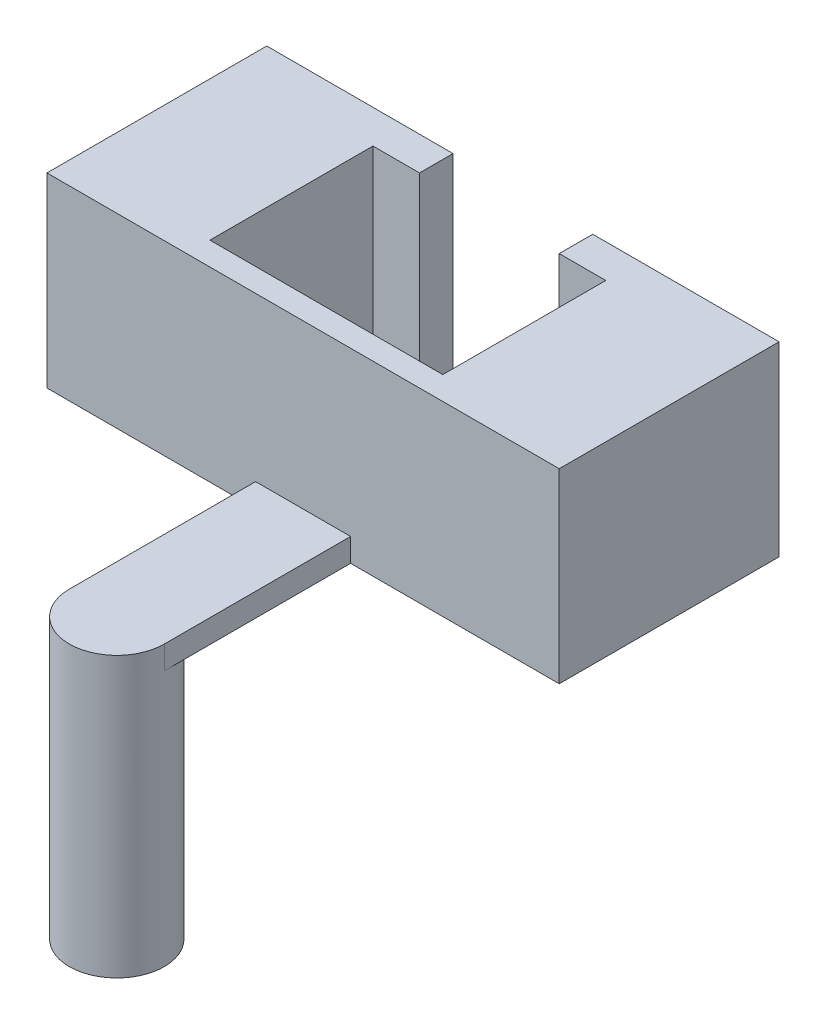
ISO-10303-21;
HEADER;
FILE_DESCRIPTION(('STEP AP214'),'2;1');
FILE_NAME('part.step','',(''),(''),'','','');
FILE_SCHEMA(('AUTOMOTIVE_DESIGN { 1 0 10303 214 1 1 1 1 }'));
ENDSEC;
DATA;
#1=APPLICATION_CONTEXT('core data for automotive mechanical design processes');
#2=APPLICATION_PROTOCOL_DEFINITION('international standard','automotive_design',2000,#1);
#3=PRODUCT_CONTEXT('',#1,'mechanical');
#4=PRODUCT('Part','Part','',(#3));
#5=PRODUCT_RELATED_PRODUCT_CATEGORY('part','',(#4));
#6=PRODUCT_DEFINITION_FORMATION('','',#4);
#7=PRODUCT_DEFINITION_CONTEXT('part definition',#1,'design');
#8=PRODUCT_DEFINITION('design','',#6,#7);
#9=PRODUCT_DEFINITION_SHAPE('','',#8);
#10=(LENGTH_UNIT() NAMED_UNIT(*) SI_UNIT(.MILLI.,.METRE.));
#11=(NAMED_UNIT(*) PLANE_ANGLE_UNIT() SI_UNIT($,.RADIAN.));
#12=(NAMED_UNIT(*) SI_UNIT($,.STERADIAN.) SOLID_ANGLE_UNIT());
#13=UNCERTAINTY_MEASURE_WITH_UNIT(LENGTH_MEASURE(1.E-05),#10,'distance_accuracy_value','');
#14=(GEOMETRIC_REPRESENTATION_CONTEXT(3) GLOBAL_UNCERTAINTY_ASSIGNED_CONTEXT((#13)) GLOBAL_UNIT_ASSIGNED_CONTEXT((#10,
#11,#12)) REPRESENTATION_CONTEXT('',''));
#15=CARTESIAN_POINT('',(0.,0.,0.));
#16=DIRECTION('',(0.,0.,1.));
#17=DIRECTION('',(1.,0.,0.));
#18=AXIS2_PLACEMENT_3D('',#15,#16,#17);
#19=CARTESIAN_POINT('',(-1.73411216451389,76.2,-7.70716517561729));
#20=DIRECTION('',(0.,-1.,0.));
#21=DIRECTION('',(0.,0.,-1.));
#22=AXIS2_PLACEMENT_3D('',#19,#20,#21);
#23=CYLINDRICAL_SURFACE('',#22,12.954);
#24=CARTESIAN_POINT('',(-1.73411216451389,76.2,-7.70716517561729));
#25=DIRECTION('',(0.,1.,0.));
#26=DIRECTION('',(0.,0.,1.));
#27=AXIS2_PLACEMENT_3D('',#24,#25,#26);
#28=CIRCLE('',#27,12.954);
#29=CARTESIAN_POINT('',(-14.6881121645139,76.2,-7.70716517561729));
#30=VERTEX_POINT('',#29);
#31=CARTESIAN_POINT('',(11.2198878354861,76.2,-7.70716517561729));
#32=VERTEX_POINT('',#31);
#33=EDGE_CURVE('E49',#30,#32,#28,.T.);
#34=ORIENTED_EDGE('',*,*,#33,.F.);
#35=DIRECTION('',(0.,1.,0.));
#36=VECTOR('',#35,1.);
#37=CARTESIAN_POINT('',(-14.6881121645139,69.85,-7.70716517561729));
#38=LINE('',#37,#36);
#39=CARTESIAN_POINT('',(-14.6881121645139,69.85,-7.70716517561729));
#40=VERTEX_POINT('',#39);
#41=EDGE_CURVE('E271',#40,#30,#38,.T.);
#42=ORIENTED_EDGE('',*,*,#41,.F.);
#43=CARTESIAN_POINT('',(-1.73411216451389,69.85,-7.70716517561729));
#44=DIRECTION('',(0.,-1.,0.));
#45=DIRECTION('',(0.,0.,-1.));
#46=AXIS2_PLACEMENT_3D('',#43,#44,#45);
#47=CIRCLE('',#46,12.954);
#48=CARTESIAN_POINT('',(11.2198878354861,69.85,-7.70716517561729));
#49=VERTEX_POINT('',#48);
#50=EDGE_CURVE('E11',#40,#49,#47,.T.);
#51=ORIENTED_EDGE('',*,*,#50,.T.);
#52=DIRECTION('',(0.,1.,0.));
#53=VECTOR('',#52,1.);
#54=CARTESIAN_POINT('',(11.2198878354861,69.85,-7.70716517561729));
#55=LINE('',#54,#53);
#56=EDGE_CURVE('E278',#49,#32,#55,.T.);
#57=ORIENTED_EDGE('',*,*,#56,.T.);
#58=EDGE_LOOP('',(#34,#42,#51,#57));
#59=FACE_BOUND('',#58,.T.);
#60=CARTESIAN_POINT('',(-1.73411216451389,0.,-7.70716517561729));
#61=DIRECTION('',(0.,1.,0.));
#62=DIRECTION('',(0.,0.,1.));
#63=AXIS2_PLACEMENT_3D('',#60,#61,#62);
#64=CIRCLE('',#63,12.954);
#65=CARTESIAN_POINT('',(-1.73411216451389,0.,5.24683482438271));
#66=VERTEX_POINT('',#65);
#67=EDGE_CURVE('E279',#66,#66,#64,.T.);
#68=ORIENTED_EDGE('',*,*,#67,.T.);
#69=EDGE_LOOP('',(#68));
#70=FACE_BOUND('',#69,.T.);
#71=ADVANCED_FACE('F43',(#59,#70),#23,.T.);
#72=CARTESIAN_POINT('',(-1.73411216451389,76.2,-7.70716517561729));
#73=DIRECTION('',(0.,1.,0.));
#74=DIRECTION('',(0.,0.,1.));
#75=AXIS2_PLACEMENT_3D('',#72,#73,#74);
#76=PLANE('',#75);
#77=ORIENTED_EDGE('',*,*,#33,.T.);
#78=DIRECTION('',(0.,0.,-1.));
#79=VECTOR('',#78,1.);
#80=CARTESIAN_POINT('',(11.2198878354861,76.2,-7.70716517561729));
#81=LINE('',#80,#79);
#82=CARTESIAN_POINT('',(11.2198878354861,76.2,-58.5071651756173));
#83=VERTEX_POINT('',#82);
#84=EDGE_CURVE('E273',#32,#83,#81,.T.);
#85=ORIENTED_EDGE('',*,*,#84,.T.);
#86=DIRECTION('',(-1.,0.,0.));
#87=VECTOR('',#86,1.);
#88=CARTESIAN_POINT('',(-14.6881121645139,76.2,-58.5071651756173));
#89=LINE('',#88,#87);
#90=CARTESIAN_POINT('',(-14.6881121645139,76.2,-58.5071651756173));
#91=VERTEX_POINT('',#90);
#92=EDGE_CURVE('E267',#83,#91,#89,.T.);
#93=ORIENTED_EDGE('',*,*,#92,.T.);
#94=DIRECTION('',(0.,0.,1.));
#95=VECTOR('',#94,1.);
#96=CARTESIAN_POINT('',(-14.6881121645139,76.2,-7.70716517561729));
#97=LINE('',#96,#95);
#98=EDGE_CURVE('E263',#91,#30,#97,.T.);
#99=ORIENTED_EDGE('',*,*,#98,.T.);
#100=EDGE_LOOP('',(#77,#85,#93,#99));
#101=FACE_BOUND('',#100,.T.);
#102=ADVANCED_FACE('F295',(#101),#76,.T.);
#103=CARTESIAN_POINT('',(-1.73411216451389,0.,-7.70716517561729));
#104=DIRECTION('',(0.,1.,0.));
#105=DIRECTION('',(0.,0.,1.));
#106=AXIS2_PLACEMENT_3D('',#103,#104,#105);
#107=PLANE('',#106);
#108=ORIENTED_EDGE('',*,*,#67,.F.);
#109=EDGE_LOOP('',(#108));
#110=FACE_BOUND('',#109,.T.);
#111=ADVANCED_FACE('F288',(#110),#107,.F.);
#112=CARTESIAN_POINT('',(-14.6881121645139,69.85,-7.70716517561729));
#113=DIRECTION('',(-1.,0.,0.));
#114=DIRECTION('',(0.,0.,1.));
#115=AXIS2_PLACEMENT_3D('',#112,#113,#114);
#116=PLANE('',#115);
#117=ORIENTED_EDGE('',*,*,#98,.F.);
#118=DIRECTION('',(0.,1.,0.));
#119=VECTOR('',#118,1.);
#120=CARTESIAN_POINT('',(-14.6881121645139,69.85,-58.5071651756173));
#121=LINE('',#120,#119);
#122=CARTESIAN_POINT('',(-14.6881121645139,69.85,-58.5071651756173));
#123=VERTEX_POINT('',#122);
#124=EDGE_CURVE('E66',#123,#91,#121,.T.);
#125=ORIENTED_EDGE('',*,*,#124,.F.);
#126=DIRECTION('',(0.,0.,1.));
#127=VECTOR('',#126,1.);
#128=CARTESIAN_POINT('',(-14.6881121645139,69.85,-7.70716517561729));
#129=LINE('',#128,#127);
#130=EDGE_CURVE('E270',#123,#40,#129,.T.);
#131=ORIENTED_EDGE('',*,*,#130,.T.);
#132=ORIENTED_EDGE('',*,*,#41,.T.);
#133=EDGE_LOOP('',(#117,#125,#131,#132));
#134=FACE_BOUND('',#133,.T.);
#135=ADVANCED_FACE('F292',(#134),#116,.T.);
#136=CARTESIAN_POINT('',(11.2198878354861,69.85,-7.70716517561729));
#137=DIRECTION('',(1.,0.,0.));
#138=DIRECTION('',(0.,0.,-1.));
#139=AXIS2_PLACEMENT_3D('',#136,#137,#138);
#140=PLANE('',#139);
#141=ORIENTED_EDGE('',*,*,#84,.F.);
#142=ORIENTED_EDGE('',*,*,#56,.F.);
#143=DIRECTION('',(0.,0.,-1.));
#144=VECTOR('',#143,1.);
#145=CARTESIAN_POINT('',(11.2198878354861,69.85,-7.70716517561729));
#146=LINE('',#145,#144);
#147=CARTESIAN_POINT('',(11.2198878354861,69.85,-58.5071651756173));
#148=VERTEX_POINT('',#147);
#149=EDGE_CURVE('E60',#49,#148,#146,.T.);
#150=ORIENTED_EDGE('',*,*,#149,.T.);
#151=DIRECTION('',(0.,1.,0.));
#152=VECTOR('',#151,1.);
#153=CARTESIAN_POINT('',(11.2198878354861,69.85,-58.5071651756173));
#154=LINE('',#153,#152);
#155=EDGE_CURVE('E82',#148,#83,#154,.T.);
#156=ORIENTED_EDGE('',*,*,#155,.T.);
#157=EDGE_LOOP('',(#141,#142,#150,#156));
#158=FACE_BOUND('',#157,.T.);
#159=ADVANCED_FACE('F300',(#158),#140,.T.);
#160=CARTESIAN_POINT('',(0.,69.85,0.));
#161=DIRECTION('',(0.,-1.,0.));
#162=DIRECTION('',(0.,0.,-1.));
#163=AXIS2_PLACEMENT_3D('',#160,#161,#162);
#164=PLANE('',#163);
#165=ORIENTED_EDGE('',*,*,#50,.F.);
#166=ORIENTED_EDGE('',*,*,#130,.F.);
#167=DIRECTION('',(-1.,0.,0.));
#168=VECTOR('',#167,1.);
#169=CARTESIAN_POINT('',(30.0158878354861,69.85,-58.5071651756173));
#170=LINE('',#169,#168);
#171=CARTESIAN_POINT('',(-71.5841121645139,69.85,-58.5071651756173));
#172=VERTEX_POINT('',#171);
#173=EDGE_CURVE('E240',#123,#172,#170,.T.);
#174=ORIENTED_EDGE('',*,*,#173,.T.);
#175=DIRECTION('',(0.,0.,-1.));
#176=VECTOR('',#175,1.);
#177=CARTESIAN_POINT('',(-71.5841121645139,69.85,-58.5071651756173));
#178=LINE('',#177,#176);
#179=CARTESIAN_POINT('',(-71.5841121645139,69.85,-118.451165175617));
#180=VERTEX_POINT('',#179);
#181=EDGE_CURVE('E230',#172,#180,#178,.T.);
#182=ORIENTED_EDGE('',*,*,#181,.T.);
#183=DIRECTION('',(-1.,0.,0.));
#184=VECTOR('',#183,1.);
#185=CARTESIAN_POINT('',(-71.5841121645139,69.85,-118.451165175617));
#186=LINE('',#185,#184);
#187=CARTESIAN_POINT('',(-20.7841121645139,69.85,-118.451165175617));
#188=VERTEX_POINT('',#187);
#189=EDGE_CURVE('E208',#188,#180,#186,.T.);
#190=ORIENTED_EDGE('',*,*,#189,.F.);
#191=DIRECTION('',(0.,0.,1.));
#192=VECTOR('',#191,1.);
#193=CARTESIAN_POINT('',(-20.7841121645139,69.85,-118.451165175617));
#194=LINE('',#193,#192);
#195=CARTESIAN_POINT('',(-20.7841121645139,69.85,-109.307165175617));
#196=VERTEX_POINT('',#195);
#197=EDGE_CURVE('E202',#188,#196,#194,.T.);
#198=ORIENTED_EDGE('',*,*,#197,.T.);
#199=DIRECTION('',(-1.,0.,0.));
#200=VECTOR('',#199,1.);
#201=CARTESIAN_POINT('',(-71.5841121645139,69.85,-109.307165175617));
#202=LINE('',#201,#200);
#203=CARTESIAN_POINT('',(-33.4841121645139,69.85,-109.307165175617));
#204=VERTEX_POINT('',#203);
#205=EDGE_CURVE('E207',#196,#204,#202,.T.);
#206=ORIENTED_EDGE('',*,*,#205,.T.);
#207=DIRECTION('',(0.,0.,1.));
#208=VECTOR('',#207,1.);
#209=CARTESIAN_POINT('',(-33.4841121645139,69.85,-58.5071651756173));
#210=LINE('',#209,#208);
#211=CARTESIAN_POINT('',(-33.4841121645139,69.85,-64.8571651756173));
#212=VERTEX_POINT('',#211);
#213=EDGE_CURVE('E226',#204,#212,#210,.T.);
#214=ORIENTED_EDGE('',*,*,#213,.T.);
#215=DIRECTION('',(-1.,0.,0.));
#216=VECTOR('',#215,1.);
#217=CARTESIAN_POINT('',(30.0158878354861,69.85,-64.8571651756173));
#218=LINE('',#217,#216);
#219=CARTESIAN_POINT('',(30.0158878354861,69.85,-64.8571651756173));
#220=VERTEX_POINT('',#219);
#221=EDGE_CURVE('E251',#220,#212,#218,.T.);
#222=ORIENTED_EDGE('',*,*,#221,.F.);
#223=DIRECTION('',(0.,0.,-1.));
#224=VECTOR('',#223,1.);
#225=CARTESIAN_POINT('',(30.0158878354861,69.85,-58.5071651756173));
#226=LINE('',#225,#224);
#227=CARTESIAN_POINT('',(30.0158878354861,69.85,-109.307165175617));
#228=VERTEX_POINT('',#227);
#229=EDGE_CURVE('E168',#220,#228,#226,.T.);
#230=ORIENTED_EDGE('',*,*,#229,.T.);
#231=DIRECTION('',(-1.,0.,0.));
#232=VECTOR('',#231,1.);
#233=CARTESIAN_POINT('',(68.1158878354861,69.85,-109.307165175617));
#234=LINE('',#233,#232);
#235=CARTESIAN_POINT('',(17.3158878354861,69.85,-109.307165175617));
#236=VERTEX_POINT('',#235);
#237=EDGE_CURVE('E195',#228,#236,#234,.T.);
#238=ORIENTED_EDGE('',*,*,#237,.T.);
#239=DIRECTION('',(0.,0.,1.));
#240=VECTOR('',#239,1.);
#241=CARTESIAN_POINT('',(17.3158878354861,69.85,-118.451165175617));
#242=LINE('',#241,#240);
#243=CARTESIAN_POINT('',(17.3158878354861,69.85,-118.451165175617));
#244=VERTEX_POINT('',#243);
#245=EDGE_CURVE('E177',#244,#236,#242,.T.);
#246=ORIENTED_EDGE('',*,*,#245,.F.);
#247=DIRECTION('',(-1.,0.,0.));
#248=VECTOR('',#247,1.);
#249=CARTESIAN_POINT('',(68.1158878354861,69.85,-118.451165175617));
#250=LINE('',#249,#248);
#251=CARTESIAN_POINT('',(68.1158878354861,69.85,-118.451165175617));
#252=VERTEX_POINT('',#251);
#253=EDGE_CURVE('E174',#252,#244,#250,.T.);
#254=ORIENTED_EDGE('',*,*,#253,.F.);
#255=DIRECTION('',(0.,0.,1.));
#256=VECTOR('',#255,1.);
#257=CARTESIAN_POINT('',(68.1158878354861,69.85,-58.5071651756173));
#258=LINE('',#257,#256);
#259=CARTESIAN_POINT('',(68.1158878354861,69.85,-58.5071651756173));
#260=VERTEX_POINT('',#259);
#261=EDGE_CURVE('E165',#252,#260,#258,.T.);
#262=ORIENTED_EDGE('',*,*,#261,.T.);
#263=EDGE_CURVE('E262',#260,#148,#170,.T.);
#264=ORIENTED_EDGE('',*,*,#263,.T.);
#265=ORIENTED_EDGE('',*,*,#149,.F.);
#266=EDGE_LOOP('',(#165,#166,#174,#182,#190,#198,#206,#214,#222,#230,#238,#246,#254,#262,#264,#265));
#267=FACE_BOUND('',#266,.T.);
#268=ADVANCED_FACE('F171',(#267),#164,.T.);
#269=CARTESIAN_POINT('',(30.0158878354861,120.65,-64.8571651756173));
#270=DIRECTION('',(0.,-1.,0.));
#271=DIRECTION('',(0.,0.,-1.));
#272=AXIS2_PLACEMENT_3D('',#269,#270,#271);
#273=PLANE('',#272);
#274=DIRECTION('',(1.,0.,0.));
#275=VECTOR('',#274,1.);
#276=CARTESIAN_POINT('',(30.0158878354861,120.65,-58.5071651756173));
#277=LINE('',#276,#275);
#278=CARTESIAN_POINT('',(-71.5841121645139,120.65,-58.5071651756173));
#279=VERTEX_POINT('',#278);
#280=CARTESIAN_POINT('',(68.1158878354861,120.65,-58.5071651756173));
#281=VERTEX_POINT('',#280);
#282=EDGE_CURVE('E255',#279,#281,#277,.T.);
#283=ORIENTED_EDGE('',*,*,#282,.T.);
#284=DIRECTION('',(0.,0.,1.));
#285=VECTOR('',#284,1.);
#286=CARTESIAN_POINT('',(68.1158878354861,120.65,-58.5071651756173));
#287=LINE('',#286,#285);
#288=CARTESIAN_POINT('',(68.1158878354861,120.65,-118.451165175617));
#289=VERTEX_POINT('',#288);
#290=EDGE_CURVE('E243',#289,#281,#287,.T.);
#291=ORIENTED_EDGE('',*,*,#290,.F.);
#292=DIRECTION('',(1.,0.,0.));
#293=VECTOR('',#292,1.);
#294=CARTESIAN_POINT('',(68.1158878354861,120.65,-118.451165175617));
#295=LINE('',#294,#293);
#296=CARTESIAN_POINT('',(17.3158878354861,120.65,-118.451165175617));
#297=VERTEX_POINT('',#296);
#298=EDGE_CURVE('E183',#297,#289,#295,.T.);
#299=ORIENTED_EDGE('',*,*,#298,.F.);
#300=DIRECTION('',(0.,0.,1.));
#301=VECTOR('',#300,1.);
#302=CARTESIAN_POINT('',(17.3158878354861,120.65,-118.451165175617));
#303=LINE('',#302,#301);
#304=CARTESIAN_POINT('',(17.3158878354861,120.65,-109.307165175617));
#305=VERTEX_POINT('',#304);
#306=EDGE_CURVE('E193',#297,#305,#303,.T.);
#307=ORIENTED_EDGE('',*,*,#306,.T.);
#308=DIRECTION('',(1.,0.,0.));
#309=VECTOR('',#308,1.);
#310=CARTESIAN_POINT('',(68.1158878354861,120.65,-109.307165175617));
#311=LINE('',#310,#309);
#312=CARTESIAN_POINT('',(30.0158878354861,120.65,-109.307165175617));
#313=VERTEX_POINT('',#312);
#314=EDGE_CURVE('E187',#305,#313,#311,.T.);
#315=ORIENTED_EDGE('',*,*,#314,.T.);
#316=DIRECTION('',(0.,0.,-1.));
#317=VECTOR('',#316,1.);
#318=CARTESIAN_POINT('',(30.0158878354861,120.65,-58.5071651756173));
#319=LINE('',#318,#317);
#320=CARTESIAN_POINT('',(30.0158878354861,120.65,-64.8571651756173));
#321=VERTEX_POINT('',#320);
#322=EDGE_CURVE('E172',#321,#313,#319,.T.);
#323=ORIENTED_EDGE('',*,*,#322,.F.);
#324=DIRECTION('',(1.,0.,0.));
#325=VECTOR('',#324,1.);
#326=CARTESIAN_POINT('',(30.0158878354861,120.65,-64.8571651756173));
#327=LINE('',#326,#325);
#328=CARTESIAN_POINT('',(-33.4841121645139,120.65,-64.8571651756173));
#329=VERTEX_POINT('',#328);
#330=EDGE_CURVE('E257',#329,#321,#327,.T.);
#331=ORIENTED_EDGE('',*,*,#330,.F.);
#332=DIRECTION('',(0.,0.,1.));
#333=VECTOR('',#332,1.);
#334=CARTESIAN_POINT('',(-33.4841121645139,120.65,-58.5071651756173));
#335=LINE('',#334,#333);
#336=CARTESIAN_POINT('',(-33.4841121645139,120.65,-109.307165175617));
#337=VERTEX_POINT('',#336);
#338=EDGE_CURVE('E221',#337,#329,#335,.T.);
#339=ORIENTED_EDGE('',*,*,#338,.F.);
#340=DIRECTION('',(1.,0.,0.));
#341=VECTOR('',#340,1.);
#342=CARTESIAN_POINT('',(-71.5841121645139,120.65,-109.307165175617));
#343=LINE('',#342,#341);
#344=CARTESIAN_POINT('',(-20.7841121645139,120.65,-109.307165175617));
#345=VERTEX_POINT('',#344);
#346=EDGE_CURVE('E197',#337,#345,#343,.T.);
#347=ORIENTED_EDGE('',*,*,#346,.T.);
#348=DIRECTION('',(0.,0.,1.));
#349=VECTOR('',#348,1.);
#350=CARTESIAN_POINT('',(-20.7841121645139,120.65,-118.451165175617));
#351=LINE('',#350,#349);
#352=CARTESIAN_POINT('',(-20.7841121645139,120.65,-118.451165175617));
#353=VERTEX_POINT('',#352);
#354=EDGE_CURVE('E205',#353,#345,#351,.T.);
#355=ORIENTED_EDGE('',*,*,#354,.F.);
#356=DIRECTION('',(1.,0.,0.));
#357=VECTOR('',#356,1.);
#358=CARTESIAN_POINT('',(-71.5841121645139,120.65,-118.451165175617));
#359=LINE('',#358,#357);
#360=CARTESIAN_POINT('',(-71.5841121645139,120.65,-118.451165175617));
#361=VERTEX_POINT('',#360);
#362=EDGE_CURVE('E219',#361,#353,#359,.T.);
#363=ORIENTED_EDGE('',*,*,#362,.F.);
#364=DIRECTION('',(0.,0.,-1.));
#365=VECTOR('',#364,1.);
#366=CARTESIAN_POINT('',(-71.5841121645139,120.65,-58.5071651756173));
#367=LINE('',#366,#365);
#368=EDGE_CURVE('E227',#279,#361,#367,.T.);
#369=ORIENTED_EDGE('',*,*,#368,.F.);
#370=EDGE_LOOP('',(#283,#291,#299,#307,#315,#323,#331,#339,#347,#355,#363,#369));
#371=FACE_BOUND('',#370,.T.);
#372=ADVANCED_FACE('F324',(#371),#273,.F.);
#373=CARTESIAN_POINT('',(0.,0.,-64.8571651756173));
#374=DIRECTION('',(0.,0.,-1.));
#375=DIRECTION('',(-1.,0.,0.));
#376=AXIS2_PLACEMENT_3D('',#373,#374,#375);
#377=PLANE('',#376);
#378=DIRECTION('',(0.,-1.,0.));
#379=VECTOR('',#378,1.);
#380=CARTESIAN_POINT('',(30.0158878354861,120.65,-64.8571651756173));
#381=LINE('',#380,#379);
#382=EDGE_CURVE('E250',#321,#220,#381,.T.);
#383=ORIENTED_EDGE('',*,*,#382,.T.);
#384=ORIENTED_EDGE('',*,*,#221,.T.);
#385=DIRECTION('',(0.,1.,0.));
#386=VECTOR('',#385,1.);
#387=CARTESIAN_POINT('',(-33.4841121645139,120.65,-64.8571651756173));
#388=LINE('',#387,#386);
#389=EDGE_CURVE('E260',#212,#329,#388,.T.);
#390=ORIENTED_EDGE('',*,*,#389,.T.);
#391=ORIENTED_EDGE('',*,*,#330,.T.);
#392=EDGE_LOOP('',(#383,#384,#390,#391));
#393=FACE_BOUND('',#392,.T.);
#394=ADVANCED_FACE('F339',(#393),#377,.T.);
#395=CARTESIAN_POINT('',(0.,0.,-58.5071651756173));
#396=DIRECTION('',(0.,0.,-1.));
#397=DIRECTION('',(-1.,0.,0.));
#398=AXIS2_PLACEMENT_3D('',#395,#396,#397);
#399=PLANE('',#398);
#400=ORIENTED_EDGE('',*,*,#155,.F.);
#401=ORIENTED_EDGE('',*,*,#263,.F.);
#402=DIRECTION('',(0.,-1.,0.));
#403=VECTOR('',#402,1.);
#404=CARTESIAN_POINT('',(68.1158878354861,120.65,-58.5071651756173));
#405=LINE('',#404,#403);
#406=EDGE_CURVE('E166',#281,#260,#405,.T.);
#407=ORIENTED_EDGE('',*,*,#406,.F.);
#408=ORIENTED_EDGE('',*,*,#282,.F.);
#409=DIRECTION('',(0.,-1.,0.));
#410=VECTOR('',#409,1.);
#411=CARTESIAN_POINT('',(-71.5841121645139,120.65,-58.5071651756173));
#412=LINE('',#411,#410);
#413=EDGE_CURVE('E229',#279,#172,#412,.T.);
#414=ORIENTED_EDGE('',*,*,#413,.T.);
#415=ORIENTED_EDGE('',*,*,#173,.F.);
#416=ORIENTED_EDGE('',*,*,#124,.T.);
#417=ORIENTED_EDGE('',*,*,#92,.F.);
#418=EDGE_LOOP('',(#400,#401,#407,#408,#414,#415,#416,#417));
#419=FACE_BOUND('',#418,.T.);
#420=ADVANCED_FACE('F309',(#419),#399,.F.);
#421=CARTESIAN_POINT('',(-33.4841121645139,120.65,-58.5071651756173));
#422=DIRECTION('',(1.,0.,0.));
#423=DIRECTION('',(0.,0.,-1.));
#424=AXIS2_PLACEMENT_3D('',#421,#422,#423);
#425=PLANE('',#424);
#426=ORIENTED_EDGE('',*,*,#389,.F.);
#427=ORIENTED_EDGE('',*,*,#213,.F.);
#428=DIRECTION('',(0.,-1.,0.));
#429=VECTOR('',#428,1.);
#430=CARTESIAN_POINT('',(-33.4841121645139,120.65,-109.307165175617));
#431=LINE('',#430,#429);
#432=EDGE_CURVE('E233',#337,#204,#431,.T.);
#433=ORIENTED_EDGE('',*,*,#432,.F.);
#434=ORIENTED_EDGE('',*,*,#338,.T.);
#435=EDGE_LOOP('',(#426,#427,#433,#434));
#436=FACE_BOUND('',#435,.T.);
#437=ADVANCED_FACE('F333',(#436),#425,.T.);
#438=CARTESIAN_POINT('',(-71.5841121645139,120.65,-58.5071651756173));
#439=DIRECTION('',(-1.,0.,0.));
#440=DIRECTION('',(0.,0.,1.));
#441=AXIS2_PLACEMENT_3D('',#438,#439,#440);
#442=PLANE('',#441);
#443=ORIENTED_EDGE('',*,*,#181,.F.);
#444=ORIENTED_EDGE('',*,*,#413,.F.);
#445=ORIENTED_EDGE('',*,*,#368,.T.);
#446=DIRECTION('',(0.,1.,0.));
#447=VECTOR('',#446,1.);
#448=CARTESIAN_POINT('',(-71.5841121645139,120.65,-118.451165175617));
#449=LINE('',#448,#447);
#450=EDGE_CURVE('E213',#180,#361,#449,.T.);
#451=ORIENTED_EDGE('',*,*,#450,.F.);
#452=EDGE_LOOP('',(#443,#444,#445,#451));
#453=FACE_BOUND('',#452,.T.);
#454=ADVANCED_FACE('F319',(#453),#442,.T.);
#455=CARTESIAN_POINT('',(30.0158878354861,120.65,-58.5071651756173));
#456=DIRECTION('',(-1.,0.,0.));
#457=DIRECTION('',(0.,0.,1.));
#458=AXIS2_PLACEMENT_3D('',#455,#456,#457);
#459=PLANE('',#458);
#460=ORIENTED_EDGE('',*,*,#382,.F.);
#461=ORIENTED_EDGE('',*,*,#322,.T.);
#462=DIRECTION('',(0.,-1.,0.));
#463=VECTOR('',#462,1.);
#464=CARTESIAN_POINT('',(30.0158878354861,120.65,-109.307165175617));
#465=LINE('',#464,#463);
#466=EDGE_CURVE('E238',#313,#228,#465,.T.);
#467=ORIENTED_EDGE('',*,*,#466,.T.);
#468=ORIENTED_EDGE('',*,*,#229,.F.);
#469=EDGE_LOOP('',(#460,#461,#467,#468));
#470=FACE_BOUND('',#469,.T.);
#471=ADVANCED_FACE('F342',(#470),#459,.T.);
#472=CARTESIAN_POINT('',(68.1158878354861,120.65,-58.5071651756173));
#473=DIRECTION('',(1.,0.,0.));
#474=DIRECTION('',(0.,0.,-1.));
#475=AXIS2_PLACEMENT_3D('',#472,#473,#474);
#476=PLANE('',#475);
#477=ORIENTED_EDGE('',*,*,#261,.F.);
#478=DIRECTION('',(0.,-1.,0.));
#479=VECTOR('',#478,1.);
#480=CARTESIAN_POINT('',(68.1158878354861,120.65,-118.451165175617));
#481=LINE('',#480,#479);
#482=EDGE_CURVE('E170',#289,#252,#481,.T.);
#483=ORIENTED_EDGE('',*,*,#482,.F.);
#484=ORIENTED_EDGE('',*,*,#290,.T.);
#485=ORIENTED_EDGE('',*,*,#406,.T.);
#486=EDGE_LOOP('',(#477,#483,#484,#485));
#487=FACE_BOUND('',#486,.T.);
#488=ADVANCED_FACE('F163',(#487),#476,.T.);
#489=CARTESIAN_POINT('',(17.3158878354861,120.65,-118.451165175617));
#490=DIRECTION('',(1.,0.,0.));
#491=DIRECTION('',(0.,1.,0.));
#492=AXIS2_PLACEMENT_3D('',#489,#490,#491);
#493=PLANE('',#492);
#494=DIRECTION('',(0.,1.,0.));
#495=VECTOR('',#494,1.);
#496=CARTESIAN_POINT('',(17.3158878354861,120.65,-109.307165175617));
#497=LINE('',#496,#495);
#498=EDGE_CURVE('E189',#236,#305,#497,.T.);
#499=ORIENTED_EDGE('',*,*,#498,.T.);
#500=ORIENTED_EDGE('',*,*,#306,.F.);
#501=DIRECTION('',(0.,1.,0.));
#502=VECTOR('',#501,1.);
#503=CARTESIAN_POINT('',(17.3158878354861,120.65,-118.451165175617));
#504=LINE('',#503,#502);
#505=EDGE_CURVE('E180',#244,#297,#504,.T.);
#506=ORIENTED_EDGE('',*,*,#505,.F.);
#507=ORIENTED_EDGE('',*,*,#245,.T.);
#508=EDGE_LOOP('',(#499,#500,#506,#507));
#509=FACE_BOUND('',#508,.T.);
#510=ADVANCED_FACE('F349',(#509),#493,.F.);
#511=CARTESIAN_POINT('',(0.,0.,-118.451165175617));
#512=DIRECTION('',(0.,0.,-1.));
#513=DIRECTION('',(-1.,0.,0.));
#514=AXIS2_PLACEMENT_3D('',#511,#512,#513);
#515=PLANE('',#514);
#516=ORIENTED_EDGE('',*,*,#482,.T.);
#517=ORIENTED_EDGE('',*,*,#253,.T.);
#518=ORIENTED_EDGE('',*,*,#505,.T.);
#519=ORIENTED_EDGE('',*,*,#298,.T.);
#520=EDGE_LOOP('',(#516,#517,#518,#519));
#521=FACE_BOUND('',#520,.T.);
#522=ADVANCED_FACE('F181',(#521),#515,.T.);
#523=CARTESIAN_POINT('',(0.,0.,-109.307165175617));
#524=DIRECTION('',(0.,0.,-1.));
#525=DIRECTION('',(-1.,0.,0.));
#526=AXIS2_PLACEMENT_3D('',#523,#524,#525);
#527=PLANE('',#526);
#528=ORIENTED_EDGE('',*,*,#466,.F.);
#529=ORIENTED_EDGE('',*,*,#314,.F.);
#530=ORIENTED_EDGE('',*,*,#498,.F.);
#531=ORIENTED_EDGE('',*,*,#237,.F.);
#532=EDGE_LOOP('',(#528,#529,#530,#531));
#533=FACE_BOUND('',#532,.T.);
#534=ADVANCED_FACE('F345',(#533),#527,.F.);
#535=CARTESIAN_POINT('',(-20.7841121645139,120.65,-118.451165175617));
#536=DIRECTION('',(-1.,0.,0.));
#537=DIRECTION('',(0.,-1.,0.));
#538=AXIS2_PLACEMENT_3D('',#535,#536,#537);
#539=PLANE('',#538);
#540=DIRECTION('',(0.,-1.,0.));
#541=VECTOR('',#540,1.);
#542=CARTESIAN_POINT('',(-20.7841121645139,120.65,-109.307165175617));
#543=LINE('',#542,#541);
#544=EDGE_CURVE('E215',#345,#196,#543,.T.);
#545=ORIENTED_EDGE('',*,*,#544,.T.);
#546=ORIENTED_EDGE('',*,*,#197,.F.);
#547=DIRECTION('',(0.,-1.,0.));
#548=VECTOR('',#547,1.);
#549=CARTESIAN_POINT('',(-20.7841121645139,120.65,-118.451165175617));
#550=LINE('',#549,#548);
#551=EDGE_CURVE('E217',#353,#188,#550,.T.);
#552=ORIENTED_EDGE('',*,*,#551,.F.);
#553=ORIENTED_EDGE('',*,*,#354,.T.);
#554=EDGE_LOOP('',(#545,#546,#552,#553));
#555=FACE_BOUND('',#554,.T.);
#556=ADVANCED_FACE('F329',(#555),#539,.F.);
#557=CARTESIAN_POINT('',(0.,0.,-118.451165175617));
#558=DIRECTION('',(0.,0.,1.));
#559=DIRECTION('',(1.,0.,0.));
#560=AXIS2_PLACEMENT_3D('',#557,#558,#559);
#561=PLANE('',#560);
#562=ORIENTED_EDGE('',*,*,#450,.T.);
#563=ORIENTED_EDGE('',*,*,#362,.T.);
#564=ORIENTED_EDGE('',*,*,#551,.T.);
#565=ORIENTED_EDGE('',*,*,#189,.T.);
#566=EDGE_LOOP('',(#562,#563,#564,#565));
#567=FACE_BOUND('',#566,.T.);
#568=ADVANCED_FACE('F320',(#567),#561,.F.);
#569=CARTESIAN_POINT('',(0.,0.,-109.307165175617));
#570=DIRECTION('',(0.,0.,1.));
#571=DIRECTION('',(1.,0.,0.));
#572=AXIS2_PLACEMENT_3D('',#569,#570,#571);
#573=PLANE('',#572);
#574=ORIENTED_EDGE('',*,*,#346,.F.);
#575=ORIENTED_EDGE('',*,*,#432,.T.);
#576=ORIENTED_EDGE('',*,*,#205,.F.);
#577=ORIENTED_EDGE('',*,*,#544,.F.);
#578=EDGE_LOOP('',(#574,#575,#576,#577));
#579=FACE_BOUND('',#578,.T.);
#580=ADVANCED_FACE('F334',(#579),#573,.T.);
#581=CLOSED_SHELL('',(#71,#102,#111,#135,#159,#268,#372,#394,#420,#437,#454,#471,#488,#510,#522,
#534,#556,#568,#580));
#582=MANIFOLD_SOLID_BREP('B2',#581);
#583=ADVANCED_BREP_SHAPE_REPRESENTATION('',(#18,#582),#14);
#584=SHAPE_DEFINITION_REPRESENTATION(#9,#583);
ENDSEC;
END-ISO-10303-21;
